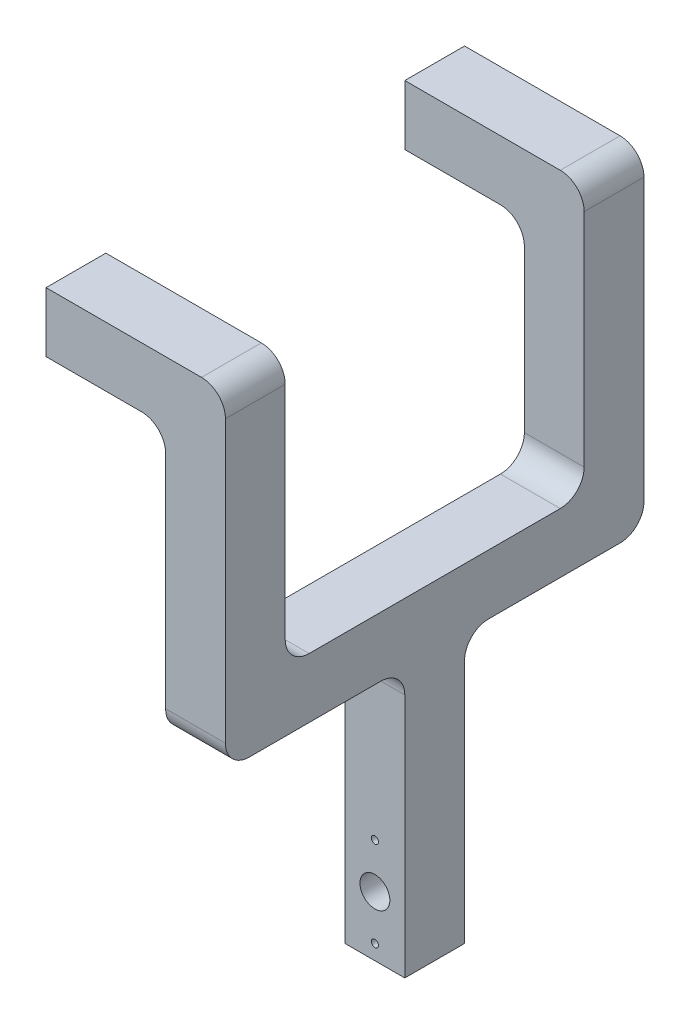
ISO-10303-21;
HEADER;
FILE_DESCRIPTION(('STEP AP214'),'2;1');
FILE_NAME('part.step','',(''),(''),'','','');
FILE_SCHEMA(('AUTOMOTIVE_DESIGN { 1 0 10303 214 1 1 1 1 }'));
ENDSEC;
DATA;
#1=APPLICATION_CONTEXT('core data for automotive mechanical design processes');
#2=APPLICATION_PROTOCOL_DEFINITION('international standard','automotive_design',2000,#1);
#3=PRODUCT_CONTEXT('',#1,'mechanical');
#4=PRODUCT('Part','Part','',(#3));
#5=PRODUCT_RELATED_PRODUCT_CATEGORY('part','',(#4));
#6=PRODUCT_DEFINITION_FORMATION('','',#4);
#7=PRODUCT_DEFINITION_CONTEXT('part definition',#1,'design');
#8=PRODUCT_DEFINITION('design','',#6,#7);
#9=PRODUCT_DEFINITION_SHAPE('','',#8);
#10=(LENGTH_UNIT() NAMED_UNIT(*) SI_UNIT(.MILLI.,.METRE.));
#11=(NAMED_UNIT(*) PLANE_ANGLE_UNIT() SI_UNIT($,.RADIAN.));
#12=(NAMED_UNIT(*) SI_UNIT($,.STERADIAN.) SOLID_ANGLE_UNIT());
#13=UNCERTAINTY_MEASURE_WITH_UNIT(LENGTH_MEASURE(1.E-05),#10,'distance_accuracy_value','');
#14=(GEOMETRIC_REPRESENTATION_CONTEXT(3) GLOBAL_UNCERTAINTY_ASSIGNED_CONTEXT((#13)) GLOBAL_UNIT_ASSIGNED_CONTEXT((#10,
#11,#12)) REPRESENTATION_CONTEXT('',''));
#15=CARTESIAN_POINT('',(0.,0.,0.));
#16=DIRECTION('',(0.,0.,1.));
#17=DIRECTION('',(1.,0.,0.));
#18=AXIS2_PLACEMENT_3D('',#15,#16,#17);
#19=CARTESIAN_POINT('',(4.,55.,10.));
#20=DIRECTION('',(1.,0.,0.));
#21=DIRECTION('',(0.,1.,0.));
#22=AXIS2_PLACEMENT_3D('',#19,#20,#21);
#23=PLANE('',#22);
#24=DIRECTION('',(0.,-1.,0.));
#25=VECTOR('',#24,1.);
#26=CARTESIAN_POINT('',(4.,55.,-20.));
#27=LINE('',#26,#25);
#28=CARTESIAN_POINT('',(4.,86.,-20.));
#29=VERTEX_POINT('',#28);
#30=CARTESIAN_POINT('',(4.,59.,-20.));
#31=VERTEX_POINT('',#30);
#32=EDGE_CURVE('E276',#29,#31,#27,.T.);
#33=ORIENTED_EDGE('',*,*,#32,.F.);
#34=DIRECTION('',(0.,0.,1.));
#35=VECTOR('',#34,1.);
#36=CARTESIAN_POINT('',(4.,86.,-30.));
#37=LINE('',#36,#35);
#38=CARTESIAN_POINT('',(4.,86.,-30.));
#39=VERTEX_POINT('',#38);
#40=EDGE_CURVE('E405',#29,#39,#37,.F.);
#41=ORIENTED_EDGE('',*,*,#40,.T.);
#42=DIRECTION('',(0.,1.,0.));
#43=VECTOR('',#42,1.);
#44=CARTESIAN_POINT('',(4.00000000000001,100.,-30.));
#45=LINE('',#44,#43);
#46=CARTESIAN_POINT('',(4.,49.,-30.));
#47=VERTEX_POINT('',#46);
#48=EDGE_CURVE('E293',#47,#39,#45,.T.);
#49=ORIENTED_EDGE('',*,*,#48,.F.);
#50=CARTESIAN_POINT('',(4.,49.,-26.));
#51=DIRECTION('',(1.,0.,0.));
#52=DIRECTION('',(0.,1.,0.));
#53=AXIS2_PLACEMENT_3D('',#50,#51,#52);
#54=CIRCLE('',#53,4.);
#55=CARTESIAN_POINT('',(4.,45.,-26.));
#56=VERTEX_POINT('',#55);
#57=EDGE_CURVE('E399',#47,#56,#54,.F.);
#58=ORIENTED_EDGE('',*,*,#57,.T.);
#59=DIRECTION('',(0.,0.,-1.));
#60=VECTOR('',#59,1.);
#61=CARTESIAN_POINT('',(4.,45.,-30.));
#62=LINE('',#61,#60);
#63=CARTESIAN_POINT('',(4.,45.,-4.));
#64=VERTEX_POINT('',#63);
#65=EDGE_CURVE('E288',#64,#56,#62,.T.);
#66=ORIENTED_EDGE('',*,*,#65,.F.);
#67=CARTESIAN_POINT('',(4.,41.,-4.));
#68=DIRECTION('',(1.,0.,0.));
#69=DIRECTION('',(0.,1.,0.));
#70=AXIS2_PLACEMENT_3D('',#67,#68,#69);
#71=CIRCLE('',#70,4.);
#72=CARTESIAN_POINT('',(4.,41.,0.));
#73=VERTEX_POINT('',#72);
#74=EDGE_CURVE('E489',#64,#73,#71,.T.);
#75=ORIENTED_EDGE('',*,*,#74,.T.);
#76=DIRECTION('',(0.,-1.,0.));
#77=VECTOR('',#76,1.);
#78=CARTESIAN_POINT('',(4.,55.,0.));
#79=LINE('',#78,#77);
#80=CARTESIAN_POINT('',(4.,0.,0.));
#81=VERTEX_POINT('',#80);
#82=EDGE_CURVE('E333',#73,#81,#79,.T.);
#83=ORIENTED_EDGE('',*,*,#82,.T.);
#84=DIRECTION('',(0.,0.,-1.));
#85=VECTOR('',#84,1.);
#86=CARTESIAN_POINT('',(4.,0.,10.));
#87=LINE('',#86,#85);
#88=CARTESIAN_POINT('',(4.,0.,10.));
#89=VERTEX_POINT('',#88);
#90=EDGE_CURVE('E368',#89,#81,#87,.T.);
#91=ORIENTED_EDGE('',*,*,#90,.F.);
#92=DIRECTION('',(0.,-1.,0.));
#93=VECTOR('',#92,1.);
#94=CARTESIAN_POINT('',(4.,55.,10.));
#95=LINE('',#94,#93);
#96=CARTESIAN_POINT('',(4.,41.,10.));
#97=VERTEX_POINT('',#96);
#98=EDGE_CURVE('E337',#97,#89,#95,.T.);
#99=ORIENTED_EDGE('',*,*,#98,.F.);
#100=CARTESIAN_POINT('',(4.,41.,14.));
#101=DIRECTION('',(1.,0.,0.));
#102=DIRECTION('',(0.,1.,0.));
#103=AXIS2_PLACEMENT_3D('',#100,#101,#102);
#104=CIRCLE('',#103,4.);
#105=CARTESIAN_POINT('',(4.,45.,14.));
#106=VERTEX_POINT('',#105);
#107=EDGE_CURVE('E11',#97,#106,#104,.T.);
#108=ORIENTED_EDGE('',*,*,#107,.T.);
#109=CARTESIAN_POINT('',(4.,45.,36.));
#110=VERTEX_POINT('',#109);
#111=EDGE_CURVE('E289',#110,#106,#62,.T.);
#112=ORIENTED_EDGE('',*,*,#111,.F.);
#113=CARTESIAN_POINT('',(4.,49.,36.));
#114=DIRECTION('',(1.,0.,0.));
#115=DIRECTION('',(0.,1.,0.));
#116=AXIS2_PLACEMENT_3D('',#113,#114,#115);
#117=CIRCLE('',#116,4.);
#118=CARTESIAN_POINT('',(4.,49.,40.));
#119=VERTEX_POINT('',#118);
#120=EDGE_CURVE('E396',#110,#119,#117,.F.);
#121=ORIENTED_EDGE('',*,*,#120,.T.);
#122=DIRECTION('',(0.,-1.,0.));
#123=VECTOR('',#122,1.);
#124=CARTESIAN_POINT('',(4.,45.,40.));
#125=LINE('',#124,#123);
#126=CARTESIAN_POINT('',(4.,86.,40.));
#127=VERTEX_POINT('',#126);
#128=EDGE_CURVE('E284',#127,#119,#125,.T.);
#129=ORIENTED_EDGE('',*,*,#128,.F.);
#130=DIRECTION('',(0.,0.,1.));
#131=VECTOR('',#130,1.);
#132=CARTESIAN_POINT('',(4.,86.,30.));
#133=LINE('',#132,#131);
#134=CARTESIAN_POINT('',(4.,86.,30.));
#135=VERTEX_POINT('',#134);
#136=EDGE_CURVE('E402',#127,#135,#133,.F.);
#137=ORIENTED_EDGE('',*,*,#136,.T.);
#138=DIRECTION('',(0.,1.,0.));
#139=VECTOR('',#138,1.);
#140=CARTESIAN_POINT('',(4.00000000000001,100.,30.));
#141=LINE('',#140,#139);
#142=CARTESIAN_POINT('',(4.,59.,30.));
#143=VERTEX_POINT('',#142);
#144=EDGE_CURVE('E280',#143,#135,#141,.T.);
#145=ORIENTED_EDGE('',*,*,#144,.F.);
#146=CARTESIAN_POINT('',(4.,59.,26.));
#147=DIRECTION('',(1.,0.,0.));
#148=DIRECTION('',(0.,1.,0.));
#149=AXIS2_PLACEMENT_3D('',#146,#147,#148);
#150=CIRCLE('',#149,4.);
#151=CARTESIAN_POINT('',(4.,55.,26.));
#152=VERTEX_POINT('',#151);
#153=EDGE_CURVE('E472',#143,#152,#150,.T.);
#154=ORIENTED_EDGE('',*,*,#153,.T.);
#155=DIRECTION('',(0.,0.,-1.));
#156=VECTOR('',#155,1.);
#157=CARTESIAN_POINT('',(4.,55.,10.));
#158=LINE('',#157,#156);
#159=CARTESIAN_POINT('',(4.,55.,-16.));
#160=VERTEX_POINT('',#159);
#161=EDGE_CURVE('E348',#152,#160,#158,.T.);
#162=ORIENTED_EDGE('',*,*,#161,.T.);
#163=CARTESIAN_POINT('',(4.,59.,-16.));
#164=DIRECTION('',(1.,0.,0.));
#165=DIRECTION('',(0.,1.,0.));
#166=AXIS2_PLACEMENT_3D('',#163,#164,#165);
#167=CIRCLE('',#166,4.);
#168=EDGE_CURVE('E466',#160,#31,#167,.T.);
#169=ORIENTED_EDGE('',*,*,#168,.T.);
#170=EDGE_LOOP('',(#33,#41,#49,#58,#66,#75,#83,#91,#99,#108,#112,#121,#129,#137,#145,#154,#162,#169));
#171=FACE_BOUND('',#170,.T.);
#172=ADVANCED_FACE('F39',(#171),#23,.F.);
#173=CARTESIAN_POINT('',(0.,0.,10.));
#174=DIRECTION('',(0.,0.,1.));
#175=DIRECTION('',(1.,0.,0.));
#176=AXIS2_PLACEMENT_3D('',#173,#174,#175);
#177=PLANE('',#176);
#178=CARTESIAN_POINT('',(9.,17.5,10.));
#179=DIRECTION('',(0.,0.,1.));
#180=DIRECTION('',(1.,0.,0.));
#181=AXIS2_PLACEMENT_3D('',#178,#179,#180);
#182=CIRCLE('',#181,0.599999999999995);
#183=CARTESIAN_POINT('',(9.59999999999999,17.5,10.));
#184=VERTEX_POINT('',#183);
#185=EDGE_CURVE('E505',#184,#184,#182,.T.);
#186=ORIENTED_EDGE('',*,*,#185,.F.);
#187=EDGE_LOOP('',(#186));
#188=FACE_BOUND('',#187,.T.);
#189=CARTESIAN_POINT('',(9.,2.5,10.));
#190=DIRECTION('',(0.,0.,1.));
#191=DIRECTION('',(1.,0.,0.));
#192=AXIS2_PLACEMENT_3D('',#189,#190,#191);
#193=CIRCLE('',#192,0.599999999999995);
#194=CARTESIAN_POINT('',(9.59999999999999,2.5,10.));
#195=VERTEX_POINT('',#194);
#196=EDGE_CURVE('E495',#195,#195,#193,.T.);
#197=ORIENTED_EDGE('',*,*,#196,.F.);
#198=EDGE_LOOP('',(#197));
#199=FACE_BOUND('',#198,.T.);
#200=DIRECTION('',(0.,1.,0.));
#201=VECTOR('',#200,1.);
#202=CARTESIAN_POINT('',(14.,55.,10.));
#203=LINE('',#202,#201);
#204=CARTESIAN_POINT('',(14.,0.,10.));
#205=VERTEX_POINT('',#204);
#206=CARTESIAN_POINT('',(14.,41.,10.));
#207=VERTEX_POINT('',#206);
#208=EDGE_CURVE('E344',#205,#207,#203,.T.);
#209=ORIENTED_EDGE('',*,*,#208,.T.);
#210=DIRECTION('',(1.,0.,0.));
#211=VECTOR('',#210,1.);
#212=CARTESIAN_POINT('',(4.,41.,10.));
#213=LINE('',#212,#211);
#214=EDGE_CURVE('E460',#207,#97,#213,.F.);
#215=ORIENTED_EDGE('',*,*,#214,.T.);
#216=ORIENTED_EDGE('',*,*,#98,.T.);
#217=DIRECTION('',(1.,0.,0.));
#218=VECTOR('',#217,1.);
#219=CARTESIAN_POINT('',(4.,0.,10.));
#220=LINE('',#219,#218);
#221=EDGE_CURVE('E340',#89,#205,#220,.T.);
#222=ORIENTED_EDGE('',*,*,#221,.T.);
#223=EDGE_LOOP('',(#209,#215,#216,#222));
#224=FACE_BOUND('',#223,.T.);
#225=CARTESIAN_POINT('',(9.,10.,10.));
#226=DIRECTION('',(0.,0.,1.));
#227=DIRECTION('',(1.,0.,0.));
#228=AXIS2_PLACEMENT_3D('',#225,#226,#227);
#229=CIRCLE('',#228,2.5);
#230=CARTESIAN_POINT('',(11.5,10.,10.));
#231=VERTEX_POINT('',#230);
#232=EDGE_CURVE('E329',#231,#231,#229,.T.);
#233=ORIENTED_EDGE('',*,*,#232,.F.);
#234=EDGE_LOOP('',(#233));
#235=FACE_BOUND('',#234,.T.);
#236=ADVANCED_FACE('F537',(#188,#199,#224,#235),#177,.T.);
#237=CARTESIAN_POINT('',(0.,0.,0.));
#238=DIRECTION('',(0.,0.,1.));
#239=DIRECTION('',(1.,0.,0.));
#240=AXIS2_PLACEMENT_3D('',#237,#238,#239);
#241=PLANE('',#240);
#242=CARTESIAN_POINT('',(9.,17.5,0.));
#243=DIRECTION('',(0.,0.,1.));
#244=DIRECTION('',(1.,0.,0.));
#245=AXIS2_PLACEMENT_3D('',#242,#243,#244);
#246=CIRCLE('',#245,0.599999999999992);
#247=CARTESIAN_POINT('',(9.59999999999999,17.5,0.));
#248=VERTEX_POINT('',#247);
#249=EDGE_CURVE('E43',#248,#248,#246,.T.);
#250=ORIENTED_EDGE('',*,*,#249,.T.);
#251=EDGE_LOOP('',(#250));
#252=FACE_BOUND('',#251,.T.);
#253=CARTESIAN_POINT('',(9.,2.5,0.));
#254=DIRECTION('',(0.,0.,1.));
#255=DIRECTION('',(1.,0.,0.));
#256=AXIS2_PLACEMENT_3D('',#253,#254,#255);
#257=CIRCLE('',#256,0.599999999999992);
#258=CARTESIAN_POINT('',(9.59999999999999,2.5,0.));
#259=VERTEX_POINT('',#258);
#260=EDGE_CURVE('E239',#259,#259,#257,.T.);
#261=ORIENTED_EDGE('',*,*,#260,.T.);
#262=EDGE_LOOP('',(#261));
#263=FACE_BOUND('',#262,.T.);
#264=ORIENTED_EDGE('',*,*,#82,.F.);
#265=DIRECTION('',(1.,0.,0.));
#266=VECTOR('',#265,1.);
#267=CARTESIAN_POINT('',(0.,41.,0.));
#268=LINE('',#267,#266);
#269=CARTESIAN_POINT('',(14.,41.,0.));
#270=VERTEX_POINT('',#269);
#271=EDGE_CURVE('E456',#73,#270,#268,.T.);
#272=ORIENTED_EDGE('',*,*,#271,.T.);
#273=DIRECTION('',(0.,1.,0.));
#274=VECTOR('',#273,1.);
#275=CARTESIAN_POINT('',(14.,55.,0.));
#276=LINE('',#275,#274);
#277=CARTESIAN_POINT('',(14.,0.,0.));
#278=VERTEX_POINT('',#277);
#279=EDGE_CURVE('E341',#278,#270,#276,.T.);
#280=ORIENTED_EDGE('',*,*,#279,.F.);
#281=DIRECTION('',(1.,0.,0.));
#282=VECTOR('',#281,1.);
#283=CARTESIAN_POINT('',(4.,0.,0.));
#284=LINE('',#283,#282);
#285=EDGE_CURVE('E351',#81,#278,#284,.T.);
#286=ORIENTED_EDGE('',*,*,#285,.F.);
#287=EDGE_LOOP('',(#264,#272,#280,#286));
#288=FACE_BOUND('',#287,.T.);
#289=CARTESIAN_POINT('',(9.,10.,0.));
#290=DIRECTION('',(0.,0.,1.));
#291=DIRECTION('',(1.,0.,0.));
#292=AXIS2_PLACEMENT_3D('',#289,#290,#291);
#293=CIRCLE('',#292,2.5);
#294=CARTESIAN_POINT('',(11.5,10.,0.));
#295=VERTEX_POINT('',#294);
#296=EDGE_CURVE('E320',#295,#295,#293,.T.);
#297=ORIENTED_EDGE('',*,*,#296,.T.);
#298=EDGE_LOOP('',(#297));
#299=FACE_BOUND('',#298,.T.);
#300=ADVANCED_FACE('F549',(#252,#263,#288,#299),#241,.F.);
#301=CARTESIAN_POINT('',(4.,0.,10.));
#302=DIRECTION('',(0.,1.,0.));
#303=DIRECTION('',(0.,0.,1.));
#304=AXIS2_PLACEMENT_3D('',#301,#302,#303);
#305=PLANE('',#304);
#306=ORIENTED_EDGE('',*,*,#285,.T.);
#307=DIRECTION('',(0.,0.,-1.));
#308=VECTOR('',#307,1.);
#309=CARTESIAN_POINT('',(14.,0.,10.));
#310=LINE('',#309,#308);
#311=EDGE_CURVE('E364',#205,#278,#310,.T.);
#312=ORIENTED_EDGE('',*,*,#311,.F.);
#313=ORIENTED_EDGE('',*,*,#221,.F.);
#314=ORIENTED_EDGE('',*,*,#90,.T.);
#315=EDGE_LOOP('',(#306,#312,#313,#314));
#316=FACE_BOUND('',#315,.T.);
#317=ADVANCED_FACE('F544',(#316),#305,.F.);
#318=CARTESIAN_POINT('',(14.,55.,10.));
#319=DIRECTION('',(-1.,0.,0.));
#320=DIRECTION('',(0.,-1.,0.));
#321=AXIS2_PLACEMENT_3D('',#318,#319,#320);
#322=PLANE('',#321);
#323=DIRECTION('',(0.,0.,-1.));
#324=VECTOR('',#323,1.);
#325=CARTESIAN_POINT('',(14.,45.,-30.));
#326=LINE('',#325,#324);
#327=CARTESIAN_POINT('',(14.,45.,-4.));
#328=VERTEX_POINT('',#327);
#329=CARTESIAN_POINT('',(14.,45.,-26.));
#330=VERTEX_POINT('',#329);
#331=EDGE_CURVE('E309',#328,#330,#326,.T.);
#332=ORIENTED_EDGE('',*,*,#331,.T.);
#333=CARTESIAN_POINT('',(14.,49.,-26.));
#334=DIRECTION('',(-1.,0.,0.));
#335=DIRECTION('',(0.,-1.,0.));
#336=AXIS2_PLACEMENT_3D('',#333,#334,#335);
#337=CIRCLE('',#336,4.);
#338=CARTESIAN_POINT('',(14.,49.,-30.));
#339=VERTEX_POINT('',#338);
#340=EDGE_CURVE('E429',#330,#339,#337,.F.);
#341=ORIENTED_EDGE('',*,*,#340,.T.);
#342=DIRECTION('',(0.,1.,0.));
#343=VECTOR('',#342,1.);
#344=CARTESIAN_POINT('',(14.,100.,-30.));
#345=LINE('',#344,#343);
#346=CARTESIAN_POINT('',(14.,96.,-30.));
#347=VERTEX_POINT('',#346);
#348=EDGE_CURVE('E281',#339,#347,#345,.T.);
#349=ORIENTED_EDGE('',*,*,#348,.T.);
#350=DIRECTION('',(0.,0.,1.));
#351=VECTOR('',#350,1.);
#352=CARTESIAN_POINT('',(14.,96.,-20.));
#353=LINE('',#352,#351);
#354=CARTESIAN_POINT('',(14.,96.,-20.));
#355=VERTEX_POINT('',#354);
#356=EDGE_CURVE('E422',#347,#355,#353,.T.);
#357=ORIENTED_EDGE('',*,*,#356,.T.);
#358=DIRECTION('',(0.,-1.,0.));
#359=VECTOR('',#358,1.);
#360=CARTESIAN_POINT('',(14.,55.,-20.));
#361=LINE('',#360,#359);
#362=CARTESIAN_POINT('',(14.,59.,-20.));
#363=VERTEX_POINT('',#362);
#364=EDGE_CURVE('E275',#355,#363,#361,.T.);
#365=ORIENTED_EDGE('',*,*,#364,.T.);
#366=CARTESIAN_POINT('',(14.,59.,-16.));
#367=DIRECTION('',(-1.,0.,0.));
#368=DIRECTION('',(0.,-1.,0.));
#369=AXIS2_PLACEMENT_3D('',#366,#367,#368);
#370=CIRCLE('',#369,4.);
#371=CARTESIAN_POINT('',(14.,55.,-16.));
#372=VERTEX_POINT('',#371);
#373=EDGE_CURVE('E463',#363,#372,#370,.T.);
#374=ORIENTED_EDGE('',*,*,#373,.T.);
#375=DIRECTION('',(0.,0.,-1.));
#376=VECTOR('',#375,1.);
#377=CARTESIAN_POINT('',(14.,55.,10.));
#378=LINE('',#377,#376);
#379=CARTESIAN_POINT('',(14.,55.,26.));
#380=VERTEX_POINT('',#379);
#381=EDGE_CURVE('E360',#380,#372,#378,.T.);
#382=ORIENTED_EDGE('',*,*,#381,.F.);
#383=CARTESIAN_POINT('',(14.,59.,26.));
#384=DIRECTION('',(-1.,0.,0.));
#385=DIRECTION('',(0.,-1.,0.));
#386=AXIS2_PLACEMENT_3D('',#383,#384,#385);
#387=CIRCLE('',#386,4.);
#388=CARTESIAN_POINT('',(14.,59.,30.));
#389=VERTEX_POINT('',#388);
#390=EDGE_CURVE('E469',#380,#389,#387,.T.);
#391=ORIENTED_EDGE('',*,*,#390,.T.);
#392=DIRECTION('',(0.,1.,0.));
#393=VECTOR('',#392,1.);
#394=CARTESIAN_POINT('',(14.,100.,30.));
#395=LINE('',#394,#393);
#396=CARTESIAN_POINT('',(14.,96.,30.));
#397=VERTEX_POINT('',#396);
#398=EDGE_CURVE('E301',#389,#397,#395,.T.);
#399=ORIENTED_EDGE('',*,*,#398,.T.);
#400=DIRECTION('',(0.,0.,1.));
#401=VECTOR('',#400,1.);
#402=CARTESIAN_POINT('',(14.,96.,40.));
#403=LINE('',#402,#401);
#404=CARTESIAN_POINT('',(14.,96.,40.));
#405=VERTEX_POINT('',#404);
#406=EDGE_CURVE('E418',#397,#405,#403,.T.);
#407=ORIENTED_EDGE('',*,*,#406,.T.);
#408=DIRECTION('',(0.,-1.,0.));
#409=VECTOR('',#408,1.);
#410=CARTESIAN_POINT('',(14.,45.,40.));
#411=LINE('',#410,#409);
#412=CARTESIAN_POINT('',(14.,49.,40.));
#413=VERTEX_POINT('',#412);
#414=EDGE_CURVE('E305',#405,#413,#411,.T.);
#415=ORIENTED_EDGE('',*,*,#414,.T.);
#416=CARTESIAN_POINT('',(14.,49.,36.));
#417=DIRECTION('',(-1.,0.,0.));
#418=DIRECTION('',(0.,-1.,0.));
#419=AXIS2_PLACEMENT_3D('',#416,#417,#418);
#420=CIRCLE('',#419,4.);
#421=CARTESIAN_POINT('',(14.,45.,36.));
#422=VERTEX_POINT('',#421);
#423=EDGE_CURVE('E426',#413,#422,#420,.F.);
#424=ORIENTED_EDGE('',*,*,#423,.T.);
#425=CARTESIAN_POINT('',(14.,45.,14.));
#426=VERTEX_POINT('',#425);
#427=EDGE_CURVE('E310',#422,#426,#326,.T.);
#428=ORIENTED_EDGE('',*,*,#427,.T.);
#429=CARTESIAN_POINT('',(14.,41.,14.));
#430=DIRECTION('',(-1.,0.,0.));
#431=DIRECTION('',(0.,-1.,0.));
#432=AXIS2_PLACEMENT_3D('',#429,#430,#431);
#433=CIRCLE('',#432,4.);
#434=EDGE_CURVE('E49',#426,#207,#433,.T.);
#435=ORIENTED_EDGE('',*,*,#434,.T.);
#436=ORIENTED_EDGE('',*,*,#208,.F.);
#437=ORIENTED_EDGE('',*,*,#311,.T.);
#438=ORIENTED_EDGE('',*,*,#279,.T.);
#439=CARTESIAN_POINT('',(14.,41.,-4.));
#440=DIRECTION('',(-1.,0.,0.));
#441=DIRECTION('',(0.,-1.,0.));
#442=AXIS2_PLACEMENT_3D('',#439,#440,#441);
#443=CIRCLE('',#442,4.);
#444=EDGE_CURVE('E486',#270,#328,#443,.T.);
#445=ORIENTED_EDGE('',*,*,#444,.T.);
#446=EDGE_LOOP('',(#332,#341,#349,#357,#365,#374,#382,#391,#399,#407,#415,#424,#428,#435,#436,
#437,#438,#445));
#447=FACE_BOUND('',#446,.T.);
#448=ADVANCED_FACE('F519',(#447),#322,.F.);
#449=CARTESIAN_POINT('',(4.,55.,10.));
#450=DIRECTION('',(0.,-1.,0.));
#451=DIRECTION('',(0.,0.,-1.));
#452=AXIS2_PLACEMENT_3D('',#449,#450,#451);
#453=PLANE('',#452);
#454=ORIENTED_EDGE('',*,*,#381,.T.);
#455=DIRECTION('',(1.,0.,0.));
#456=VECTOR('',#455,1.);
#457=CARTESIAN_POINT('',(4.,55.,-16.));
#458=LINE('',#457,#456);
#459=EDGE_CURVE('E383',#372,#160,#458,.F.);
#460=ORIENTED_EDGE('',*,*,#459,.T.);
#461=ORIENTED_EDGE('',*,*,#161,.F.);
#462=DIRECTION('',(1.,0.,0.));
#463=VECTOR('',#462,1.);
#464=CARTESIAN_POINT('',(4.,55.,26.));
#465=LINE('',#464,#463);
#466=EDGE_CURVE('E379',#152,#380,#465,.T.);
#467=ORIENTED_EDGE('',*,*,#466,.T.);
#468=EDGE_LOOP('',(#454,#460,#461,#467));
#469=FACE_BOUND('',#468,.T.);
#470=ADVANCED_FACE('F589',(#469),#453,.F.);
#471=CARTESIAN_POINT('',(9.,10.,10.));
#472=DIRECTION('',(0.,0.,-1.));
#473=DIRECTION('',(-1.,0.,0.));
#474=AXIS2_PLACEMENT_3D('',#471,#472,#473);
#475=CYLINDRICAL_SURFACE('',#474,2.5);
#476=ORIENTED_EDGE('',*,*,#232,.T.);
#477=EDGE_LOOP('',(#476));
#478=FACE_BOUND('',#477,.T.);
#479=ORIENTED_EDGE('',*,*,#296,.F.);
#480=EDGE_LOOP('',(#479));
#481=FACE_BOUND('',#480,.T.);
#482=ADVANCED_FACE('F749',(#478,#481),#475,.F.);
#483=CARTESIAN_POINT('',(4.,55.,-20.));
#484=DIRECTION('',(0.,0.,1.));
#485=DIRECTION('',(0.,-1.,0.));
#486=AXIS2_PLACEMENT_3D('',#483,#484,#485);
#487=PLANE('',#486);
#488=ORIENTED_EDGE('',*,*,#32,.T.);
#489=DIRECTION('',(1.,0.,0.));
#490=VECTOR('',#489,1.);
#491=CARTESIAN_POINT('',(4.,59.,-20.));
#492=LINE('',#491,#490);
#493=EDGE_CURVE('E375',#31,#363,#492,.T.);
#494=ORIENTED_EDGE('',*,*,#493,.T.);
#495=ORIENTED_EDGE('',*,*,#364,.F.);
#496=CARTESIAN_POINT('',(10.,96.,-20.));
#497=DIRECTION('',(0.,0.,1.));
#498=DIRECTION('',(0.,-1.,0.));
#499=AXIS2_PLACEMENT_3D('',#496,#497,#498);
#500=CIRCLE('',#499,4.);
#501=CARTESIAN_POINT('',(10.,100.,-20.));
#502=VERTEX_POINT('',#501);
#503=EDGE_CURVE('E372',#355,#502,#500,.T.);
#504=ORIENTED_EDGE('',*,*,#503,.T.);
#505=DIRECTION('',(1.,0.,0.));
#506=VECTOR('',#505,1.);
#507=CARTESIAN_POINT('',(4.00000000000001,100.,-20.));
#508=LINE('',#507,#506);
#509=CARTESIAN_POINT('',(-16.,100.,-20.));
#510=VERTEX_POINT('',#509);
#511=EDGE_CURVE('E317',#510,#502,#508,.T.);
#512=ORIENTED_EDGE('',*,*,#511,.F.);
#513=DIRECTION('',(0.,1.,0.));
#514=VECTOR('',#513,1.);
#515=CARTESIAN_POINT('',(-16.,100.,-20.));
#516=LINE('',#515,#514);
#517=CARTESIAN_POINT('',(-16.,90.,-20.));
#518=VERTEX_POINT('',#517);
#519=EDGE_CURVE('E259',#518,#510,#516,.T.);
#520=ORIENTED_EDGE('',*,*,#519,.F.);
#521=DIRECTION('',(1.,0.,0.));
#522=VECTOR('',#521,1.);
#523=CARTESIAN_POINT('',(-16.,90.,-20.));
#524=LINE('',#523,#522);
#525=CARTESIAN_POINT('',(0.,90.,-20.));
#526=VERTEX_POINT('',#525);
#527=EDGE_CURVE('E267',#518,#526,#524,.T.);
#528=ORIENTED_EDGE('',*,*,#527,.T.);
#529=CARTESIAN_POINT('',(0.,86.,-20.));
#530=DIRECTION('',(0.,0.,1.));
#531=DIRECTION('',(0.,-1.,0.));
#532=AXIS2_PLACEMENT_3D('',#529,#530,#531);
#533=CIRCLE('',#532,4.);
#534=EDGE_CURVE('E475',#526,#29,#533,.F.);
#535=ORIENTED_EDGE('',*,*,#534,.T.);
#536=EDGE_LOOP('',(#488,#494,#495,#504,#512,#520,#528,#535));
#537=FACE_BOUND('',#536,.T.);
#538=ADVANCED_FACE('F580',(#537),#487,.T.);
#539=CARTESIAN_POINT('',(4.00000000000001,100.,-20.));
#540=DIRECTION('',(0.,1.,0.));
#541=DIRECTION('',(-1.,0.,0.));
#542=AXIS2_PLACEMENT_3D('',#539,#540,#541);
#543=PLANE('',#542);
#544=ORIENTED_EDGE('',*,*,#511,.T.);
#545=DIRECTION('',(0.,0.,1.));
#546=VECTOR('',#545,1.);
#547=CARTESIAN_POINT('',(10.,100.,-30.));
#548=LINE('',#547,#546);
#549=CARTESIAN_POINT('',(10.,100.,-30.));
#550=VERTEX_POINT('',#549);
#551=EDGE_CURVE('E65',#502,#550,#548,.F.);
#552=ORIENTED_EDGE('',*,*,#551,.T.);
#553=DIRECTION('',(1.,0.,0.));
#554=VECTOR('',#553,1.);
#555=CARTESIAN_POINT('',(4.00000000000001,100.,-30.));
#556=LINE('',#555,#554);
#557=CARTESIAN_POINT('',(-16.,100.,-30.));
#558=VERTEX_POINT('',#557);
#559=EDGE_CURVE('E321',#558,#550,#556,.T.);
#560=ORIENTED_EDGE('',*,*,#559,.F.);
#561=DIRECTION('',(0.,0.,-1.));
#562=VECTOR('',#561,1.);
#563=CARTESIAN_POINT('',(-16.,100.,-30.));
#564=LINE('',#563,#562);
#565=EDGE_CURVE('E263',#510,#558,#564,.T.);
#566=ORIENTED_EDGE('',*,*,#565,.F.);
#567=EDGE_LOOP('',(#544,#552,#560,#566));
#568=FACE_BOUND('',#567,.T.);
#569=ADVANCED_FACE('F734',(#568),#543,.T.);
#570=CARTESIAN_POINT('',(4.00000000000001,100.,-30.));
#571=DIRECTION('',(0.,0.,-1.));
#572=DIRECTION('',(0.,1.,0.));
#573=AXIS2_PLACEMENT_3D('',#570,#571,#572);
#574=PLANE('',#573);
#575=ORIENTED_EDGE('',*,*,#348,.F.);
#576=DIRECTION('',(1.,0.,0.));
#577=VECTOR('',#576,1.);
#578=CARTESIAN_POINT('',(4.,49.,-30.));
#579=LINE('',#578,#577);
#580=EDGE_CURVE('E435',#339,#47,#579,.F.);
#581=ORIENTED_EDGE('',*,*,#580,.T.);
#582=ORIENTED_EDGE('',*,*,#48,.T.);
#583=CARTESIAN_POINT('',(0.,86.,-30.));
#584=DIRECTION('',(0.,0.,-1.));
#585=DIRECTION('',(0.,1.,0.));
#586=AXIS2_PLACEMENT_3D('',#583,#584,#585);
#587=CIRCLE('',#586,4.);
#588=CARTESIAN_POINT('',(0.,90.,-30.));
#589=VERTEX_POINT('',#588);
#590=EDGE_CURVE('E478',#39,#589,#587,.F.);
#591=ORIENTED_EDGE('',*,*,#590,.T.);
#592=DIRECTION('',(1.,0.,0.));
#593=VECTOR('',#592,1.);
#594=CARTESIAN_POINT('',(-16.,90.,-30.));
#595=LINE('',#594,#593);
#596=CARTESIAN_POINT('',(-16.,90.,-30.));
#597=VERTEX_POINT('',#596);
#598=EDGE_CURVE('E271',#597,#589,#595,.T.);
#599=ORIENTED_EDGE('',*,*,#598,.F.);
#600=DIRECTION('',(0.,-1.,0.));
#601=VECTOR('',#600,1.);
#602=CARTESIAN_POINT('',(-16.,100.,-30.));
#603=LINE('',#602,#601);
#604=EDGE_CURVE('E247',#558,#597,#603,.T.);
#605=ORIENTED_EDGE('',*,*,#604,.F.);
#606=ORIENTED_EDGE('',*,*,#559,.T.);
#607=CARTESIAN_POINT('',(10.,96.,-30.));
#608=DIRECTION('',(0.,0.,-1.));
#609=DIRECTION('',(0.,1.,0.));
#610=AXIS2_PLACEMENT_3D('',#607,#608,#609);
#611=CIRCLE('',#610,4.);
#612=EDGE_CURVE('E432',#550,#347,#611,.T.);
#613=ORIENTED_EDGE('',*,*,#612,.T.);
#614=EDGE_LOOP('',(#575,#581,#582,#591,#599,#605,#606,#613));
#615=FACE_BOUND('',#614,.T.);
#616=ADVANCED_FACE('F572',(#615),#574,.T.);
#617=CARTESIAN_POINT('',(4.,45.,-30.));
#618=DIRECTION('',(0.,-1.,0.));
#619=DIRECTION('',(0.,0.,-1.));
#620=AXIS2_PLACEMENT_3D('',#617,#618,#619);
#621=PLANE('',#620);
#622=ORIENTED_EDGE('',*,*,#65,.T.);
#623=DIRECTION('',(1.,0.,0.));
#624=VECTOR('',#623,1.);
#625=CARTESIAN_POINT('',(4.,45.,-26.));
#626=LINE('',#625,#624);
#627=EDGE_CURVE('E414',#56,#330,#626,.T.);
#628=ORIENTED_EDGE('',*,*,#627,.T.);
#629=ORIENTED_EDGE('',*,*,#331,.F.);
#630=DIRECTION('',(1.,0.,0.));
#631=VECTOR('',#630,1.);
#632=CARTESIAN_POINT('',(4.,45.,-4.));
#633=LINE('',#632,#631);
#634=EDGE_CURVE('E411',#328,#64,#633,.F.);
#635=ORIENTED_EDGE('',*,*,#634,.T.);
#636=EDGE_LOOP('',(#622,#628,#629,#635));
#637=FACE_BOUND('',#636,.T.);
#638=ADVANCED_FACE('F559',(#637),#621,.T.);
#639=ORIENTED_EDGE('',*,*,#427,.F.);
#640=DIRECTION('',(1.,0.,0.));
#641=VECTOR('',#640,1.);
#642=CARTESIAN_POINT('',(4.,45.,36.));
#643=LINE('',#642,#641);
#644=EDGE_CURVE('E448',#422,#110,#643,.F.);
#645=ORIENTED_EDGE('',*,*,#644,.T.);
#646=ORIENTED_EDGE('',*,*,#111,.T.);
#647=DIRECTION('',(1.,0.,0.));
#648=VECTOR('',#647,1.);
#649=CARTESIAN_POINT('',(14.,45.,14.));
#650=LINE('',#649,#648);
#651=EDGE_CURVE('E444',#106,#426,#650,.T.);
#652=ORIENTED_EDGE('',*,*,#651,.T.);
#653=EDGE_LOOP('',(#639,#645,#646,#652));
#654=FACE_BOUND('',#653,.T.);
#655=ADVANCED_FACE('F529',(#654),#621,.T.);
#656=CARTESIAN_POINT('',(4.,45.,40.));
#657=DIRECTION('',(0.,0.,1.));
#658=DIRECTION('',(1.,0.,0.));
#659=AXIS2_PLACEMENT_3D('',#656,#657,#658);
#660=PLANE('',#659);
#661=ORIENTED_EDGE('',*,*,#128,.T.);
#662=DIRECTION('',(1.,0.,0.));
#663=VECTOR('',#662,1.);
#664=CARTESIAN_POINT('',(4.,49.,40.));
#665=LINE('',#664,#663);
#666=EDGE_CURVE('E440',#119,#413,#665,.T.);
#667=ORIENTED_EDGE('',*,*,#666,.T.);
#668=ORIENTED_EDGE('',*,*,#414,.F.);
#669=CARTESIAN_POINT('',(10.,96.,40.));
#670=DIRECTION('',(0.,0.,1.));
#671=DIRECTION('',(1.,0.,0.));
#672=AXIS2_PLACEMENT_3D('',#669,#670,#671);
#673=CIRCLE('',#672,4.);
#674=CARTESIAN_POINT('',(10.,100.,40.));
#675=VERTEX_POINT('',#674);
#676=EDGE_CURVE('E57',#405,#675,#673,.T.);
#677=ORIENTED_EDGE('',*,*,#676,.T.);
#678=DIRECTION('',(1.,0.,0.));
#679=VECTOR('',#678,1.);
#680=CARTESIAN_POINT('',(4.00000000000001,100.,40.));
#681=LINE('',#680,#679);
#682=CARTESIAN_POINT('',(-16.,100.,40.));
#683=VERTEX_POINT('',#682);
#684=EDGE_CURVE('E324',#683,#675,#681,.T.);
#685=ORIENTED_EDGE('',*,*,#684,.F.);
#686=DIRECTION('',(0.,1.,0.));
#687=VECTOR('',#686,1.);
#688=CARTESIAN_POINT('',(-16.,100.,40.));
#689=LINE('',#688,#687);
#690=CARTESIAN_POINT('',(-16.,90.,40.));
#691=VERTEX_POINT('',#690);
#692=EDGE_CURVE('E228',#691,#683,#689,.T.);
#693=ORIENTED_EDGE('',*,*,#692,.F.);
#694=DIRECTION('',(1.,0.,0.));
#695=VECTOR('',#694,1.);
#696=CARTESIAN_POINT('',(-16.,90.,40.));
#697=LINE('',#696,#695);
#698=CARTESIAN_POINT('',(0.,90.,40.));
#699=VERTEX_POINT('',#698);
#700=EDGE_CURVE('E223',#691,#699,#697,.T.);
#701=ORIENTED_EDGE('',*,*,#700,.T.);
#702=CARTESIAN_POINT('',(0.,86.,40.));
#703=DIRECTION('',(0.,0.,1.));
#704=DIRECTION('',(1.,0.,0.));
#705=AXIS2_PLACEMENT_3D('',#702,#703,#704);
#706=CIRCLE('',#705,4.);
#707=EDGE_CURVE('E481',#699,#127,#706,.F.);
#708=ORIENTED_EDGE('',*,*,#707,.T.);
#709=EDGE_LOOP('',(#661,#667,#668,#677,#685,#693,#701,#708));
#710=FACE_BOUND('',#709,.T.);
#711=ADVANCED_FACE('F520',(#710),#660,.T.);
#712=CARTESIAN_POINT('',(4.00000000000001,100.,40.));
#713=DIRECTION('',(0.,1.,0.));
#714=DIRECTION('',(0.,0.,1.));
#715=AXIS2_PLACEMENT_3D('',#712,#713,#714);
#716=PLANE('',#715);
#717=ORIENTED_EDGE('',*,*,#684,.T.);
#718=DIRECTION('',(0.,0.,1.));
#719=VECTOR('',#718,1.);
#720=CARTESIAN_POINT('',(10.,100.,30.));
#721=LINE('',#720,#719);
#722=CARTESIAN_POINT('',(10.,100.,30.));
#723=VERTEX_POINT('',#722);
#724=EDGE_CURVE('E453',#675,#723,#721,.F.);
#725=ORIENTED_EDGE('',*,*,#724,.T.);
#726=DIRECTION('',(1.,0.,0.));
#727=VECTOR('',#726,1.);
#728=CARTESIAN_POINT('',(4.00000000000001,100.,30.));
#729=LINE('',#728,#727);
#730=CARTESIAN_POINT('',(-16.,100.,30.));
#731=VERTEX_POINT('',#730);
#732=EDGE_CURVE('E297',#731,#723,#729,.T.);
#733=ORIENTED_EDGE('',*,*,#732,.F.);
#734=DIRECTION('',(0.,0.,-1.));
#735=VECTOR('',#734,1.);
#736=CARTESIAN_POINT('',(-16.,100.,30.));
#737=LINE('',#736,#735);
#738=EDGE_CURVE('E235',#683,#731,#737,.T.);
#739=ORIENTED_EDGE('',*,*,#738,.F.);
#740=EDGE_LOOP('',(#717,#725,#733,#739));
#741=FACE_BOUND('',#740,.T.);
#742=ADVANCED_FACE('F511',(#741),#716,.T.);
#743=CARTESIAN_POINT('',(4.00000000000001,100.,30.));
#744=DIRECTION('',(0.,0.,-1.));
#745=DIRECTION('',(-1.,0.,0.));
#746=AXIS2_PLACEMENT_3D('',#743,#744,#745);
#747=PLANE('',#746);
#748=ORIENTED_EDGE('',*,*,#398,.F.);
#749=DIRECTION('',(1.,0.,0.));
#750=VECTOR('',#749,1.);
#751=CARTESIAN_POINT('',(4.00000000000001,59.,30.));
#752=LINE('',#751,#750);
#753=EDGE_CURVE('E389',#389,#143,#752,.F.);
#754=ORIENTED_EDGE('',*,*,#753,.T.);
#755=ORIENTED_EDGE('',*,*,#144,.T.);
#756=CARTESIAN_POINT('',(0.,86.,30.));
#757=DIRECTION('',(0.,0.,-1.));
#758=DIRECTION('',(-1.,0.,0.));
#759=AXIS2_PLACEMENT_3D('',#756,#757,#758);
#760=CIRCLE('',#759,4.);
#761=CARTESIAN_POINT('',(0.,90.,30.));
#762=VERTEX_POINT('',#761);
#763=EDGE_CURVE('E245',#135,#762,#760,.F.);
#764=ORIENTED_EDGE('',*,*,#763,.T.);
#765=DIRECTION('',(1.,0.,0.));
#766=VECTOR('',#765,1.);
#767=CARTESIAN_POINT('',(-16.,90.,30.));
#768=LINE('',#767,#766);
#769=CARTESIAN_POINT('',(-16.,90.,30.));
#770=VERTEX_POINT('',#769);
#771=EDGE_CURVE('E220',#770,#762,#768,.T.);
#772=ORIENTED_EDGE('',*,*,#771,.F.);
#773=DIRECTION('',(0.,-1.,0.));
#774=VECTOR('',#773,1.);
#775=CARTESIAN_POINT('',(-16.,100.,30.));
#776=LINE('',#775,#774);
#777=EDGE_CURVE('E229',#731,#770,#776,.T.);
#778=ORIENTED_EDGE('',*,*,#777,.F.);
#779=ORIENTED_EDGE('',*,*,#732,.T.);
#780=CARTESIAN_POINT('',(10.,96.,30.));
#781=DIRECTION('',(0.,0.,-1.));
#782=DIRECTION('',(-1.,0.,0.));
#783=AXIS2_PLACEMENT_3D('',#780,#781,#782);
#784=CIRCLE('',#783,4.);
#785=EDGE_CURVE('E386',#723,#397,#784,.T.);
#786=ORIENTED_EDGE('',*,*,#785,.T.);
#787=EDGE_LOOP('',(#748,#754,#755,#764,#772,#778,#779,#786));
#788=FACE_BOUND('',#787,.T.);
#789=ADVANCED_FACE('F242',(#788),#747,.T.);
#790=CARTESIAN_POINT('',(-16.,90.,-30.));
#791=DIRECTION('',(0.,1.,0.));
#792=DIRECTION('',(-1.,0.,0.));
#793=AXIS2_PLACEMENT_3D('',#790,#791,#792);
#794=PLANE('',#793);
#795=ORIENTED_EDGE('',*,*,#598,.T.);
#796=DIRECTION('',(0.,0.,1.));
#797=VECTOR('',#796,1.);
#798=CARTESIAN_POINT('',(0.,90.,-20.));
#799=LINE('',#798,#797);
#800=EDGE_CURVE('E392',#589,#526,#799,.T.);
#801=ORIENTED_EDGE('',*,*,#800,.T.);
#802=ORIENTED_EDGE('',*,*,#527,.F.);
#803=DIRECTION('',(0.,0.,1.));
#804=VECTOR('',#803,1.);
#805=CARTESIAN_POINT('',(-16.,90.,-30.));
#806=LINE('',#805,#804);
#807=EDGE_CURVE('E252',#597,#518,#806,.T.);
#808=ORIENTED_EDGE('',*,*,#807,.F.);
#809=EDGE_LOOP('',(#795,#801,#802,#808));
#810=FACE_BOUND('',#809,.T.);
#811=ADVANCED_FACE('F729',(#810),#794,.F.);
#812=CARTESIAN_POINT('',(-16.,0.,0.));
#813=DIRECTION('',(-1.,0.,0.));
#814=DIRECTION('',(0.,-1.,0.));
#815=AXIS2_PLACEMENT_3D('',#812,#813,#814);
#816=PLANE('',#815);
#817=ORIENTED_EDGE('',*,*,#604,.T.);
#818=ORIENTED_EDGE('',*,*,#807,.T.);
#819=ORIENTED_EDGE('',*,*,#519,.T.);
#820=ORIENTED_EDGE('',*,*,#565,.T.);
#821=EDGE_LOOP('',(#817,#818,#819,#820));
#822=FACE_BOUND('',#821,.T.);
#823=ADVANCED_FACE('F726',(#822),#816,.T.);
#824=CARTESIAN_POINT('',(-16.,90.,30.));
#825=DIRECTION('',(0.,1.,0.));
#826=DIRECTION('',(-1.,0.,0.));
#827=AXIS2_PLACEMENT_3D('',#824,#825,#826);
#828=PLANE('',#827);
#829=ORIENTED_EDGE('',*,*,#771,.T.);
#830=DIRECTION('',(0.,0.,1.));
#831=VECTOR('',#830,1.);
#832=CARTESIAN_POINT('',(0.,90.,40.));
#833=LINE('',#832,#831);
#834=EDGE_CURVE('E408',#762,#699,#833,.T.);
#835=ORIENTED_EDGE('',*,*,#834,.T.);
#836=ORIENTED_EDGE('',*,*,#700,.F.);
#837=DIRECTION('',(0.,0.,1.));
#838=VECTOR('',#837,1.);
#839=CARTESIAN_POINT('',(-16.,90.,30.));
#840=LINE('',#839,#838);
#841=EDGE_CURVE('E215',#770,#691,#840,.T.);
#842=ORIENTED_EDGE('',*,*,#841,.F.);
#843=EDGE_LOOP('',(#829,#835,#836,#842));
#844=FACE_BOUND('',#843,.T.);
#845=ADVANCED_FACE('F217',(#844),#828,.F.);
#846=CARTESIAN_POINT('',(-16.,0.,0.));
#847=DIRECTION('',(-1.,0.,0.));
#848=DIRECTION('',(0.,-1.,0.));
#849=AXIS2_PLACEMENT_3D('',#846,#847,#848);
#850=PLANE('',#849);
#851=ORIENTED_EDGE('',*,*,#777,.T.);
#852=ORIENTED_EDGE('',*,*,#841,.T.);
#853=ORIENTED_EDGE('',*,*,#692,.T.);
#854=ORIENTED_EDGE('',*,*,#738,.T.);
#855=EDGE_LOOP('',(#851,#852,#853,#854));
#856=FACE_BOUND('',#855,.T.);
#857=ADVANCED_FACE('F233',(#856),#850,.T.);
#858=CARTESIAN_POINT('',(4.,59.,-16.));
#859=DIRECTION('',(1.,0.,0.));
#860=DIRECTION('',(0.,0.,-1.));
#861=AXIS2_PLACEMENT_3D('',#858,#859,#860);
#862=CYLINDRICAL_SURFACE('',#861,4.);
#863=ORIENTED_EDGE('',*,*,#168,.F.);
#864=ORIENTED_EDGE('',*,*,#459,.F.);
#865=ORIENTED_EDGE('',*,*,#373,.F.);
#866=ORIENTED_EDGE('',*,*,#493,.F.);
#867=EDGE_LOOP('',(#863,#864,#865,#866));
#868=FACE_BOUND('',#867,.T.);
#869=ADVANCED_FACE('F585',(#868),#862,.F.);
#870=CARTESIAN_POINT('',(4.,59.,26.));
#871=DIRECTION('',(1.,0.,0.));
#872=DIRECTION('',(0.,0.,-1.));
#873=AXIS2_PLACEMENT_3D('',#870,#871,#872);
#874=CYLINDRICAL_SURFACE('',#873,4.);
#875=ORIENTED_EDGE('',*,*,#153,.F.);
#876=ORIENTED_EDGE('',*,*,#753,.F.);
#877=ORIENTED_EDGE('',*,*,#390,.F.);
#878=ORIENTED_EDGE('',*,*,#466,.F.);
#879=EDGE_LOOP('',(#875,#876,#877,#878));
#880=FACE_BOUND('',#879,.T.);
#881=ADVANCED_FACE('F594',(#880),#874,.F.);
#882=CARTESIAN_POINT('',(0.,86.,-30.));
#883=DIRECTION('',(0.,0.,-1.));
#884=DIRECTION('',(-1.,0.,0.));
#885=AXIS2_PLACEMENT_3D('',#882,#883,#884);
#886=CYLINDRICAL_SURFACE('',#885,4.);
#887=ORIENTED_EDGE('',*,*,#590,.F.);
#888=ORIENTED_EDGE('',*,*,#40,.F.);
#889=ORIENTED_EDGE('',*,*,#534,.F.);
#890=ORIENTED_EDGE('',*,*,#800,.F.);
#891=EDGE_LOOP('',(#887,#888,#889,#890));
#892=FACE_BOUND('',#891,.T.);
#893=ADVANCED_FACE('F601',(#892),#886,.F.);
#894=CARTESIAN_POINT('',(0.,86.,30.));
#895=DIRECTION('',(0.,0.,-1.));
#896=DIRECTION('',(-1.,0.,0.));
#897=AXIS2_PLACEMENT_3D('',#894,#895,#896);
#898=CYLINDRICAL_SURFACE('',#897,4.);
#899=ORIENTED_EDGE('',*,*,#763,.F.);
#900=ORIENTED_EDGE('',*,*,#136,.F.);
#901=ORIENTED_EDGE('',*,*,#707,.F.);
#902=ORIENTED_EDGE('',*,*,#834,.F.);
#903=EDGE_LOOP('',(#899,#900,#901,#902));
#904=FACE_BOUND('',#903,.T.);
#905=ADVANCED_FACE('F599',(#904),#898,.F.);
#906=CARTESIAN_POINT('',(4.,49.,-26.));
#907=DIRECTION('',(1.,0.,0.));
#908=DIRECTION('',(0.,1.,0.));
#909=AXIS2_PLACEMENT_3D('',#906,#907,#908);
#910=CYLINDRICAL_SURFACE('',#909,4.);
#911=ORIENTED_EDGE('',*,*,#57,.F.);
#912=ORIENTED_EDGE('',*,*,#580,.F.);
#913=ORIENTED_EDGE('',*,*,#340,.F.);
#914=ORIENTED_EDGE('',*,*,#627,.F.);
#915=EDGE_LOOP('',(#911,#912,#913,#914));
#916=FACE_BOUND('',#915,.T.);
#917=ADVANCED_FACE('F567',(#916),#910,.T.);
#918=CARTESIAN_POINT('',(4.,49.,36.));
#919=DIRECTION('',(1.,0.,0.));
#920=DIRECTION('',(0.,1.,0.));
#921=AXIS2_PLACEMENT_3D('',#918,#919,#920);
#922=CYLINDRICAL_SURFACE('',#921,4.);
#923=ORIENTED_EDGE('',*,*,#120,.F.);
#924=ORIENTED_EDGE('',*,*,#644,.F.);
#925=ORIENTED_EDGE('',*,*,#423,.F.);
#926=ORIENTED_EDGE('',*,*,#666,.F.);
#927=EDGE_LOOP('',(#923,#924,#925,#926));
#928=FACE_BOUND('',#927,.T.);
#929=ADVANCED_FACE('F525',(#928),#922,.T.);
#930=CARTESIAN_POINT('',(10.,96.,10.));
#931=DIRECTION('',(0.,0.,-1.));
#932=DIRECTION('',(-1.,0.,0.));
#933=AXIS2_PLACEMENT_3D('',#930,#931,#932);
#934=CYLINDRICAL_SURFACE('',#933,4.);
#935=ORIENTED_EDGE('',*,*,#612,.F.);
#936=ORIENTED_EDGE('',*,*,#551,.F.);
#937=ORIENTED_EDGE('',*,*,#503,.F.);
#938=ORIENTED_EDGE('',*,*,#356,.F.);
#939=EDGE_LOOP('',(#935,#936,#937,#938));
#940=FACE_BOUND('',#939,.T.);
#941=ADVANCED_FACE('F577',(#940),#934,.T.);
#942=CARTESIAN_POINT('',(10.,96.,9.99999999999994));
#943=DIRECTION('',(0.,0.,-1.));
#944=DIRECTION('',(0.,1.,0.));
#945=AXIS2_PLACEMENT_3D('',#942,#943,#944);
#946=CYLINDRICAL_SURFACE('',#945,4.);
#947=ORIENTED_EDGE('',*,*,#785,.F.);
#948=ORIENTED_EDGE('',*,*,#724,.F.);
#949=ORIENTED_EDGE('',*,*,#676,.F.);
#950=ORIENTED_EDGE('',*,*,#406,.F.);
#951=EDGE_LOOP('',(#947,#948,#949,#950));
#952=FACE_BOUND('',#951,.T.);
#953=ADVANCED_FACE('F516',(#952),#946,.T.);
#954=CARTESIAN_POINT('',(0.,41.,-4.));
#955=DIRECTION('',(1.,0.,0.));
#956=DIRECTION('',(0.,1.,0.));
#957=AXIS2_PLACEMENT_3D('',#954,#955,#956);
#958=CYLINDRICAL_SURFACE('',#957,4.);
#959=ORIENTED_EDGE('',*,*,#74,.F.);
#960=ORIENTED_EDGE('',*,*,#634,.F.);
#961=ORIENTED_EDGE('',*,*,#444,.F.);
#962=ORIENTED_EDGE('',*,*,#271,.F.);
#963=EDGE_LOOP('',(#959,#960,#961,#962));
#964=FACE_BOUND('',#963,.T.);
#965=ADVANCED_FACE('F554',(#964),#958,.F.);
#966=CARTESIAN_POINT('',(4.,41.,14.));
#967=DIRECTION('',(-1.,0.,0.));
#968=DIRECTION('',(0.,-1.,0.));
#969=AXIS2_PLACEMENT_3D('',#966,#967,#968);
#970=CYLINDRICAL_SURFACE('',#969,4.);
#971=ORIENTED_EDGE('',*,*,#107,.F.);
#972=ORIENTED_EDGE('',*,*,#214,.F.);
#973=ORIENTED_EDGE('',*,*,#434,.F.);
#974=ORIENTED_EDGE('',*,*,#651,.F.);
#975=EDGE_LOOP('',(#971,#972,#973,#974));
#976=FACE_BOUND('',#975,.T.);
#977=ADVANCED_FACE('F41',(#976),#970,.F.);
#978=CARTESIAN_POINT('',(9.,2.5,10.));
#979=DIRECTION('',(0.,0.,1.));
#980=DIRECTION('',(1.,0.,0.));
#981=AXIS2_PLACEMENT_3D('',#978,#979,#980);
#982=CYLINDRICAL_SURFACE('',#981,0.599999999999992);
#983=ORIENTED_EDGE('',*,*,#196,.T.);
#984=EDGE_LOOP('',(#983));
#985=FACE_BOUND('',#984,.T.);
#986=ORIENTED_EDGE('',*,*,#260,.F.);
#987=EDGE_LOOP('',(#986));
#988=FACE_BOUND('',#987,.T.);
#989=ADVANCED_FACE('F682',(#985,#988),#982,.F.);
#990=CARTESIAN_POINT('',(9.,17.5,10.));
#991=DIRECTION('',(0.,0.,1.));
#992=DIRECTION('',(1.,0.,0.));
#993=AXIS2_PLACEMENT_3D('',#990,#991,#992);
#994=CYLINDRICAL_SURFACE('',#993,0.599999999999992);
#995=ORIENTED_EDGE('',*,*,#185,.T.);
#996=EDGE_LOOP('',(#995));
#997=FACE_BOUND('',#996,.T.);
#998=ORIENTED_EDGE('',*,*,#249,.F.);
#999=EDGE_LOOP('',(#998));
#1000=FACE_BOUND('',#999,.T.);
#1001=ADVANCED_FACE('F707',(#997,#1000),#994,.F.);
#1002=CLOSED_SHELL('',(#172,#236,#300,#317,#448,#470,#482,#538,#569,#616,#638,#655,#711,#742,
#789,#811,#823,#845,#857,#869,#881,#893,#905,#917,#929,#941,#953,#965,#977,#989,#1001));
#1003=MANIFOLD_SOLID_BREP('B2',#1002);
#1004=ADVANCED_BREP_SHAPE_REPRESENTATION('',(#18,#1003),#14);
#1005=SHAPE_DEFINITION_REPRESENTATION(#9,#1004);
ENDSEC;
END-ISO-10303-21;
